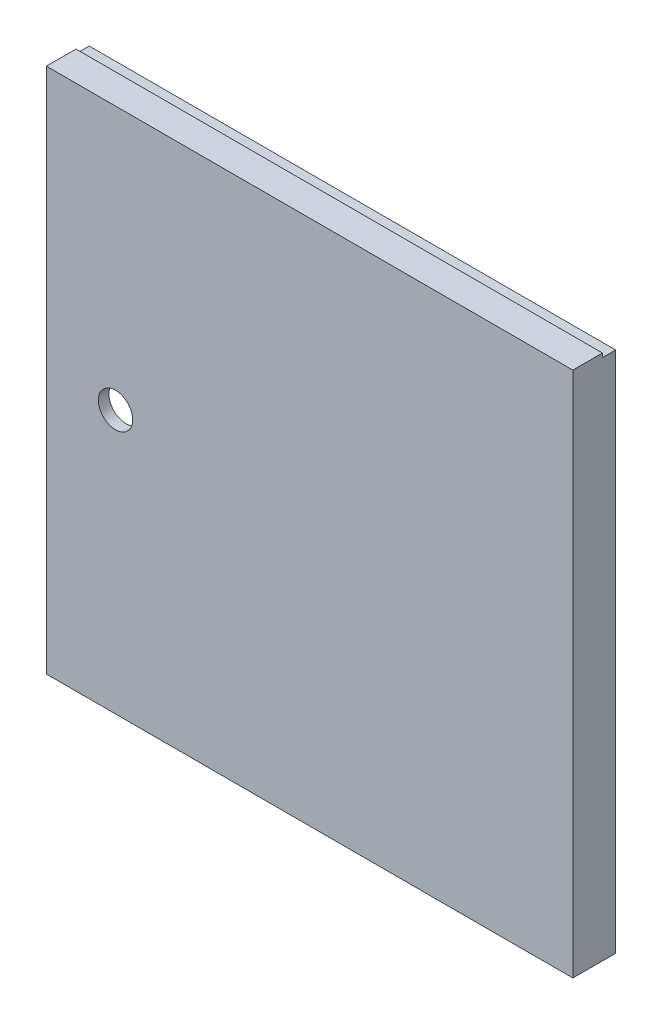
ISO-10303-21;
HEADER;
FILE_DESCRIPTION(('STEP AP214'),'2;1');
FILE_NAME('part.step','',(''),(''),'','','');
FILE_SCHEMA(('AUTOMOTIVE_DESIGN { 1 0 10303 214 1 1 1 1 }'));
ENDSEC;
DATA;
#1=APPLICATION_CONTEXT('core data for automotive mechanical design processes');
#2=APPLICATION_PROTOCOL_DEFINITION('international standard','automotive_design',2000,#1);
#3=PRODUCT_CONTEXT('',#1,'mechanical');
#4=PRODUCT('Part','Part','',(#3));
#5=PRODUCT_RELATED_PRODUCT_CATEGORY('part','',(#4));
#6=PRODUCT_DEFINITION_FORMATION('','',#4);
#7=PRODUCT_DEFINITION_CONTEXT('part definition',#1,'design');
#8=PRODUCT_DEFINITION('design','',#6,#7);
#9=PRODUCT_DEFINITION_SHAPE('','',#8);
#10=(LENGTH_UNIT() NAMED_UNIT(*) SI_UNIT(.MILLI.,.METRE.));
#11=(NAMED_UNIT(*) PLANE_ANGLE_UNIT() SI_UNIT($,.RADIAN.));
#12=(NAMED_UNIT(*) SI_UNIT($,.STERADIAN.) SOLID_ANGLE_UNIT());
#13=UNCERTAINTY_MEASURE_WITH_UNIT(LENGTH_MEASURE(1.E-05),#10,'distance_accuracy_value','');
#14=(GEOMETRIC_REPRESENTATION_CONTEXT(3) GLOBAL_UNCERTAINTY_ASSIGNED_CONTEXT((#13)) GLOBAL_UNIT_ASSIGNED_CONTEXT((#10,
#11,#12)) REPRESENTATION_CONTEXT('',''));
#15=CARTESIAN_POINT('',(0.,0.,0.));
#16=DIRECTION('',(0.,0.,1.));
#17=DIRECTION('',(1.,0.,0.));
#18=AXIS2_PLACEMENT_3D('',#15,#16,#17);
#19=CARTESIAN_POINT('',(50.8,-50.8,8.255));
#20=DIRECTION('',(-1.,0.,0.));
#21=DIRECTION('',(0.,0.,1.));
#22=AXIS2_PLACEMENT_3D('',#19,#20,#21);
#23=PLANE('',#22);
#24=DIRECTION('',(0.,1.,0.));
#25=VECTOR('',#24,1.);
#26=CARTESIAN_POINT('',(50.8,-50.8,0.));
#27=LINE('',#26,#25);
#28=CARTESIAN_POINT('',(50.8,-50.8,0.));
#29=VERTEX_POINT('',#28);
#30=CARTESIAN_POINT('',(50.8,50.038,0.));
#31=VERTEX_POINT('',#30);
#32=EDGE_CURVE('E146',#29,#31,#27,.T.);
#33=ORIENTED_EDGE('',*,*,#32,.T.);
#34=DIRECTION('',(0.,0.,-1.));
#35=VECTOR('',#34,1.);
#36=CARTESIAN_POINT('',(50.8,50.038,0.));
#37=LINE('',#36,#35);
#38=CARTESIAN_POINT('',(50.8,50.038,2.54));
#39=VERTEX_POINT('',#38);
#40=EDGE_CURVE('E49',#39,#31,#37,.T.);
#41=ORIENTED_EDGE('',*,*,#40,.F.);
#42=DIRECTION('',(0.,-1.,0.));
#43=VECTOR('',#42,1.);
#44=CARTESIAN_POINT('',(50.8,50.8,2.54));
#45=LINE('',#44,#43);
#46=CARTESIAN_POINT('',(50.8,50.8,2.54));
#47=VERTEX_POINT('',#46);
#48=EDGE_CURVE('E191',#47,#39,#45,.T.);
#49=ORIENTED_EDGE('',*,*,#48,.F.);
#50=DIRECTION('',(0.,0.,-1.));
#51=VECTOR('',#50,1.);
#52=CARTESIAN_POINT('',(50.8,50.8,8.255));
#53=LINE('',#52,#51);
#54=CARTESIAN_POINT('',(50.8,50.8,8.255));
#55=VERTEX_POINT('',#54);
#56=EDGE_CURVE('E12',#55,#47,#53,.T.);
#57=ORIENTED_EDGE('',*,*,#56,.F.);
#58=DIRECTION('',(0.,1.,0.));
#59=VECTOR('',#58,1.);
#60=CARTESIAN_POINT('',(50.8,-50.8,8.255));
#61=LINE('',#60,#59);
#62=CARTESIAN_POINT('',(50.8,-50.8,8.255));
#63=VERTEX_POINT('',#62);
#64=EDGE_CURVE('E143',#63,#55,#61,.T.);
#65=ORIENTED_EDGE('',*,*,#64,.F.);
#66=DIRECTION('',(0.,0.,-1.));
#67=VECTOR('',#66,1.);
#68=CARTESIAN_POINT('',(50.8,-50.8,8.255));
#69=LINE('',#68,#67);
#70=EDGE_CURVE('E135',#63,#29,#69,.T.);
#71=ORIENTED_EDGE('',*,*,#70,.T.);
#72=EDGE_LOOP('',(#33,#41,#49,#57,#65,#71));
#73=FACE_BOUND('',#72,.T.);
#74=ADVANCED_FACE('F35',(#73),#23,.F.);
#75=CARTESIAN_POINT('',(-50.8,50.8,8.255));
#76=DIRECTION('',(0.,-1.,0.));
#77=DIRECTION('',(0.,0.,-1.));
#78=AXIS2_PLACEMENT_3D('',#75,#76,#77);
#79=PLANE('',#78);
#80=ORIENTED_EDGE('',*,*,#56,.T.);
#81=DIRECTION('',(1.,0.,0.));
#82=VECTOR('',#81,1.);
#83=CARTESIAN_POINT('',(-50.8,50.8,2.54));
#84=LINE('',#83,#82);
#85=CARTESIAN_POINT('',(-50.8,50.8,2.54));
#86=VERTEX_POINT('',#85);
#87=EDGE_CURVE('E115',#86,#47,#84,.T.);
#88=ORIENTED_EDGE('',*,*,#87,.F.);
#89=DIRECTION('',(0.,0.,-1.));
#90=VECTOR('',#89,1.);
#91=CARTESIAN_POINT('',(-50.8,50.8,8.255));
#92=LINE('',#91,#90);
#93=CARTESIAN_POINT('',(-50.8,50.8,8.255));
#94=VERTEX_POINT('',#93);
#95=EDGE_CURVE('E42',#94,#86,#92,.T.);
#96=ORIENTED_EDGE('',*,*,#95,.F.);
#97=DIRECTION('',(-1.,0.,0.));
#98=VECTOR('',#97,1.);
#99=CARTESIAN_POINT('',(-50.8,50.8,8.255));
#100=LINE('',#99,#98);
#101=EDGE_CURVE('E152',#55,#94,#100,.T.);
#102=ORIENTED_EDGE('',*,*,#101,.F.);
#103=EDGE_LOOP('',(#80,#88,#96,#102));
#104=FACE_BOUND('',#103,.T.);
#105=ADVANCED_FACE('F126',(#104),#79,.F.);
#106=CARTESIAN_POINT('',(-50.8,-50.8,8.255));
#107=DIRECTION('',(1.,0.,0.));
#108=DIRECTION('',(0.,0.,-1.));
#109=AXIS2_PLACEMENT_3D('',#106,#107,#108);
#110=PLANE('',#109);
#111=DIRECTION('',(0.,-1.,0.));
#112=VECTOR('',#111,1.);
#113=CARTESIAN_POINT('',(-50.8,50.8,2.54));
#114=LINE('',#113,#112);
#115=CARTESIAN_POINT('',(-50.8,50.038,2.54));
#116=VERTEX_POINT('',#115);
#117=EDGE_CURVE('E111',#86,#116,#114,.T.);
#118=ORIENTED_EDGE('',*,*,#117,.T.);
#119=DIRECTION('',(0.,0.,-1.));
#120=VECTOR('',#119,1.);
#121=CARTESIAN_POINT('',(-50.8,50.038,0.));
#122=LINE('',#121,#120);
#123=CARTESIAN_POINT('',(-50.8,50.038,0.));
#124=VERTEX_POINT('',#123);
#125=EDGE_CURVE('E122',#116,#124,#122,.T.);
#126=ORIENTED_EDGE('',*,*,#125,.T.);
#127=DIRECTION('',(0.,-1.,0.));
#128=VECTOR('',#127,1.);
#129=CARTESIAN_POINT('',(-50.8,-50.8,0.));
#130=LINE('',#129,#128);
#131=CARTESIAN_POINT('',(-50.8,-50.8,0.));
#132=VERTEX_POINT('',#131);
#133=EDGE_CURVE('E144',#124,#132,#130,.T.);
#134=ORIENTED_EDGE('',*,*,#133,.T.);
#135=DIRECTION('',(0.,0.,-1.));
#136=VECTOR('',#135,1.);
#137=CARTESIAN_POINT('',(-50.8,-50.8,8.255));
#138=LINE('',#137,#136);
#139=CARTESIAN_POINT('',(-50.8,-50.8,8.255));
#140=VERTEX_POINT('',#139);
#141=EDGE_CURVE('E133',#140,#132,#138,.T.);
#142=ORIENTED_EDGE('',*,*,#141,.F.);
#143=DIRECTION('',(0.,-1.,0.));
#144=VECTOR('',#143,1.);
#145=CARTESIAN_POINT('',(-50.8,-50.8,8.255));
#146=LINE('',#145,#144);
#147=EDGE_CURVE('E132',#94,#140,#146,.T.);
#148=ORIENTED_EDGE('',*,*,#147,.F.);
#149=ORIENTED_EDGE('',*,*,#95,.T.);
#150=EDGE_LOOP('',(#118,#126,#134,#142,#148,#149));
#151=FACE_BOUND('',#150,.T.);
#152=ADVANCED_FACE('F130',(#151),#110,.F.);
#153=CARTESIAN_POINT('',(-50.8,-50.8,8.255));
#154=DIRECTION('',(0.,1.,0.));
#155=DIRECTION('',(0.,0.,1.));
#156=AXIS2_PLACEMENT_3D('',#153,#154,#155);
#157=PLANE('',#156);
#158=DIRECTION('',(1.,0.,0.));
#159=VECTOR('',#158,1.);
#160=CARTESIAN_POINT('',(-50.8,-50.8,0.));
#161=LINE('',#160,#159);
#162=EDGE_CURVE('E141',#132,#29,#161,.T.);
#163=ORIENTED_EDGE('',*,*,#162,.T.);
#164=ORIENTED_EDGE('',*,*,#70,.F.);
#165=DIRECTION('',(1.,0.,0.));
#166=VECTOR('',#165,1.);
#167=CARTESIAN_POINT('',(-50.8,-50.8,8.255));
#168=LINE('',#167,#166);
#169=EDGE_CURVE('E140',#140,#63,#168,.T.);
#170=ORIENTED_EDGE('',*,*,#169,.F.);
#171=ORIENTED_EDGE('',*,*,#141,.T.);
#172=EDGE_LOOP('',(#163,#164,#170,#171));
#173=FACE_BOUND('',#172,.T.);
#174=ADVANCED_FACE('F201',(#173),#157,.F.);
#175=CARTESIAN_POINT('',(0.,0.,8.255));
#176=DIRECTION('',(0.,0.,-1.));
#177=DIRECTION('',(-1.,0.,0.));
#178=AXIS2_PLACEMENT_3D('',#175,#176,#177);
#179=PLANE('',#178);
#180=CARTESIAN_POINT('',(-37.4564909021522,0.,8.255));
#181=DIRECTION('',(0.,0.,1.));
#182=DIRECTION('',(1.,0.,0.));
#183=AXIS2_PLACEMENT_3D('',#180,#181,#182);
#184=CIRCLE('',#183,3.31110911723338);
#185=CARTESIAN_POINT('',(-34.1453817849189,0.,8.255));
#186=VERTEX_POINT('',#185);
#187=EDGE_CURVE('E182',#186,#186,#184,.T.);
#188=ORIENTED_EDGE('',*,*,#187,.F.);
#189=EDGE_LOOP('',(#188));
#190=FACE_BOUND('',#189,.T.);
#191=ORIENTED_EDGE('',*,*,#64,.T.);
#192=ORIENTED_EDGE('',*,*,#101,.T.);
#193=ORIENTED_EDGE('',*,*,#147,.T.);
#194=ORIENTED_EDGE('',*,*,#169,.T.);
#195=EDGE_LOOP('',(#191,#192,#193,#194));
#196=FACE_BOUND('',#195,.T.);
#197=ADVANCED_FACE('F206',(#190,#196),#179,.F.);
#198=CARTESIAN_POINT('',(0.,0.,0.));
#199=DIRECTION('',(0.,0.,-1.));
#200=DIRECTION('',(-1.,0.,0.));
#201=AXIS2_PLACEMENT_3D('',#198,#199,#200);
#202=PLANE('',#201);
#203=DIRECTION('',(1.,0.,0.));
#204=VECTOR('',#203,1.);
#205=CARTESIAN_POINT('',(-50.8,50.038,0.));
#206=LINE('',#205,#204);
#207=EDGE_CURVE('E185',#124,#31,#206,.T.);
#208=ORIENTED_EDGE('',*,*,#207,.T.);
#209=ORIENTED_EDGE('',*,*,#32,.F.);
#210=ORIENTED_EDGE('',*,*,#162,.F.);
#211=ORIENTED_EDGE('',*,*,#133,.F.);
#212=EDGE_LOOP('',(#208,#209,#210,#211));
#213=FACE_BOUND('',#212,.T.);
#214=DIRECTION('',(0.,-1.,0.));
#215=VECTOR('',#214,1.);
#216=CARTESIAN_POINT('',(48.768,-48.768,0.));
#217=LINE('',#216,#215);
#218=CARTESIAN_POINT('',(48.768,48.768,0.));
#219=VERTEX_POINT('',#218);
#220=CARTESIAN_POINT('',(48.768,-48.768,0.));
#221=VERTEX_POINT('',#220);
#222=EDGE_CURVE('E57',#219,#221,#217,.T.);
#223=ORIENTED_EDGE('',*,*,#222,.F.);
#224=DIRECTION('',(1.,0.,0.));
#225=VECTOR('',#224,1.);
#226=CARTESIAN_POINT('',(48.768,48.768,0.));
#227=LINE('',#226,#225);
#228=CARTESIAN_POINT('',(-48.768,48.768,0.));
#229=VERTEX_POINT('',#228);
#230=EDGE_CURVE('E161',#229,#219,#227,.T.);
#231=ORIENTED_EDGE('',*,*,#230,.F.);
#232=DIRECTION('',(0.,1.,0.));
#233=VECTOR('',#232,1.);
#234=CARTESIAN_POINT('',(-48.768,-48.768,0.));
#235=LINE('',#234,#233);
#236=CARTESIAN_POINT('',(-48.768,-48.768,0.));
#237=VERTEX_POINT('',#236);
#238=EDGE_CURVE('E170',#237,#229,#235,.T.);
#239=ORIENTED_EDGE('',*,*,#238,.F.);
#240=DIRECTION('',(-1.,0.,0.));
#241=VECTOR('',#240,1.);
#242=CARTESIAN_POINT('',(48.768,-48.768,0.));
#243=LINE('',#242,#241);
#244=EDGE_CURVE('E173',#221,#237,#243,.T.);
#245=ORIENTED_EDGE('',*,*,#244,.F.);
#246=EDGE_LOOP('',(#223,#231,#239,#245));
#247=FACE_BOUND('',#246,.T.);
#248=ADVANCED_FACE('F196',(#213,#247),#202,.T.);
#249=CARTESIAN_POINT('',(48.768,-48.768,146.191734019622));
#250=DIRECTION('',(1.,0.,0.));
#251=DIRECTION('',(0.,0.,-1.));
#252=AXIS2_PLACEMENT_3D('',#249,#250,#251);
#253=PLANE('',#252);
#254=DIRECTION('',(0.,1.,0.));
#255=VECTOR('',#254,1.);
#256=CARTESIAN_POINT('',(48.768,-48.768,6.22300000000001));
#257=LINE('',#256,#255);
#258=CARTESIAN_POINT('',(48.768,-48.768,6.22300000000001));
#259=VERTEX_POINT('',#258);
#260=CARTESIAN_POINT('',(48.768,48.768,6.22300000000001));
#261=VERTEX_POINT('',#260);
#262=EDGE_CURVE('E157',#259,#261,#257,.T.);
#263=ORIENTED_EDGE('',*,*,#262,.T.);
#264=DIRECTION('',(0.,0.,-1.));
#265=VECTOR('',#264,1.);
#266=CARTESIAN_POINT('',(48.768,48.768,146.191734019622));
#267=LINE('',#266,#265);
#268=EDGE_CURVE('E165',#261,#219,#267,.T.);
#269=ORIENTED_EDGE('',*,*,#268,.T.);
#270=ORIENTED_EDGE('',*,*,#222,.T.);
#271=DIRECTION('',(0.,0.,-1.));
#272=VECTOR('',#271,1.);
#273=CARTESIAN_POINT('',(48.768,-48.768,146.191734019622));
#274=LINE('',#273,#272);
#275=EDGE_CURVE('E158',#259,#221,#274,.T.);
#276=ORIENTED_EDGE('',*,*,#275,.F.);
#277=EDGE_LOOP('',(#263,#269,#270,#276));
#278=FACE_BOUND('',#277,.T.);
#279=ADVANCED_FACE('F214',(#278),#253,.F.);
#280=CARTESIAN_POINT('',(48.768,48.768,146.191734019622));
#281=DIRECTION('',(0.,1.,0.));
#282=DIRECTION('',(0.,0.,1.));
#283=AXIS2_PLACEMENT_3D('',#280,#281,#282);
#284=PLANE('',#283);
#285=DIRECTION('',(-1.,0.,0.));
#286=VECTOR('',#285,1.);
#287=CARTESIAN_POINT('',(48.768,48.768,6.22300000000001));
#288=LINE('',#287,#286);
#289=CARTESIAN_POINT('',(-48.768,48.768,6.22300000000001));
#290=VERTEX_POINT('',#289);
#291=EDGE_CURVE('E179',#261,#290,#288,.T.);
#292=ORIENTED_EDGE('',*,*,#291,.T.);
#293=DIRECTION('',(0.,0.,-1.));
#294=VECTOR('',#293,1.);
#295=CARTESIAN_POINT('',(-48.768,48.768,146.191734019622));
#296=LINE('',#295,#294);
#297=EDGE_CURVE('E163',#290,#229,#296,.T.);
#298=ORIENTED_EDGE('',*,*,#297,.T.);
#299=ORIENTED_EDGE('',*,*,#230,.T.);
#300=ORIENTED_EDGE('',*,*,#268,.F.);
#301=EDGE_LOOP('',(#292,#298,#299,#300));
#302=FACE_BOUND('',#301,.T.);
#303=ADVANCED_FACE('F244',(#302),#284,.F.);
#304=CARTESIAN_POINT('',(-48.768,-48.768,146.191734019622));
#305=DIRECTION('',(-1.,0.,0.));
#306=DIRECTION('',(0.,0.,1.));
#307=AXIS2_PLACEMENT_3D('',#304,#305,#306);
#308=PLANE('',#307);
#309=DIRECTION('',(0.,-1.,0.));
#310=VECTOR('',#309,1.);
#311=CARTESIAN_POINT('',(-48.768,-48.768,6.22300000000001));
#312=LINE('',#311,#310);
#313=CARTESIAN_POINT('',(-48.768,-48.768,6.22300000000001));
#314=VERTEX_POINT('',#313);
#315=EDGE_CURVE('E167',#290,#314,#312,.T.);
#316=ORIENTED_EDGE('',*,*,#315,.T.);
#317=DIRECTION('',(0.,0.,-1.));
#318=VECTOR('',#317,1.);
#319=CARTESIAN_POINT('',(-48.768,-48.768,146.191734019622));
#320=LINE('',#319,#318);
#321=EDGE_CURVE('E160',#314,#237,#320,.T.);
#322=ORIENTED_EDGE('',*,*,#321,.T.);
#323=ORIENTED_EDGE('',*,*,#238,.T.);
#324=ORIENTED_EDGE('',*,*,#297,.F.);
#325=EDGE_LOOP('',(#316,#322,#323,#324));
#326=FACE_BOUND('',#325,.T.);
#327=ADVANCED_FACE('F253',(#326),#308,.F.);
#328=CARTESIAN_POINT('',(48.768,-48.768,146.191734019622));
#329=DIRECTION('',(0.,-1.,0.));
#330=DIRECTION('',(0.,0.,-1.));
#331=AXIS2_PLACEMENT_3D('',#328,#329,#330);
#332=PLANE('',#331);
#333=DIRECTION('',(1.,0.,0.));
#334=VECTOR('',#333,1.);
#335=CARTESIAN_POINT('',(48.768,-48.768,6.22300000000001));
#336=LINE('',#335,#334);
#337=EDGE_CURVE('E149',#314,#259,#336,.T.);
#338=ORIENTED_EDGE('',*,*,#337,.T.);
#339=ORIENTED_EDGE('',*,*,#275,.T.);
#340=ORIENTED_EDGE('',*,*,#244,.T.);
#341=ORIENTED_EDGE('',*,*,#321,.F.);
#342=EDGE_LOOP('',(#338,#339,#340,#341));
#343=FACE_BOUND('',#342,.T.);
#344=ADVANCED_FACE('F263',(#343),#332,.F.);
#345=CARTESIAN_POINT('',(0.,0.,6.223));
#346=DIRECTION('',(0.,0.,-1.));
#347=DIRECTION('',(-1.,0.,0.));
#348=AXIS2_PLACEMENT_3D('',#345,#346,#347);
#349=PLANE('',#348);
#350=CARTESIAN_POINT('',(-37.4564909021522,0.,6.223));
#351=DIRECTION('',(0.,0.,1.));
#352=DIRECTION('',(1.,0.,0.));
#353=AXIS2_PLACEMENT_3D('',#350,#351,#352);
#354=CIRCLE('',#353,3.31110911723338);
#355=CARTESIAN_POINT('',(-34.1453817849189,0.,6.223));
#356=VERTEX_POINT('',#355);
#357=EDGE_CURVE('E177',#356,#356,#354,.T.);
#358=ORIENTED_EDGE('',*,*,#357,.T.);
#359=EDGE_LOOP('',(#358));
#360=FACE_BOUND('',#359,.T.);
#361=ORIENTED_EDGE('',*,*,#262,.F.);
#362=ORIENTED_EDGE('',*,*,#337,.F.);
#363=ORIENTED_EDGE('',*,*,#315,.F.);
#364=ORIENTED_EDGE('',*,*,#291,.F.);
#365=EDGE_LOOP('',(#361,#362,#363,#364));
#366=FACE_BOUND('',#365,.T.);
#367=ADVANCED_FACE('F272',(#360,#366),#349,.T.);
#368=CARTESIAN_POINT('',(-37.4564909021522,0.,6.223));
#369=DIRECTION('',(0.,0.,1.));
#370=DIRECTION('',(1.,0.,0.));
#371=AXIS2_PLACEMENT_3D('',#368,#369,#370);
#372=CYLINDRICAL_SURFACE('',#371,3.31110911723338);
#373=ORIENTED_EDGE('',*,*,#357,.F.);
#374=EDGE_LOOP('',(#373));
#375=FACE_BOUND('',#374,.T.);
#376=ORIENTED_EDGE('',*,*,#187,.T.);
#377=EDGE_LOOP('',(#376));
#378=FACE_BOUND('',#377,.T.);
#379=ADVANCED_FACE('F286',(#375,#378),#372,.F.);
#380=CARTESIAN_POINT('',(-50.8,50.038,0.));
#381=DIRECTION('',(0.,-1.,0.));
#382=DIRECTION('',(0.,0.,-1.));
#383=AXIS2_PLACEMENT_3D('',#380,#381,#382);
#384=PLANE('',#383);
#385=ORIENTED_EDGE('',*,*,#40,.T.);
#386=ORIENTED_EDGE('',*,*,#207,.F.);
#387=ORIENTED_EDGE('',*,*,#125,.F.);
#388=DIRECTION('',(1.,0.,0.));
#389=VECTOR('',#388,1.);
#390=CARTESIAN_POINT('',(-50.8,50.038,2.54));
#391=LINE('',#390,#389);
#392=EDGE_CURVE('E117',#116,#39,#391,.T.);
#393=ORIENTED_EDGE('',*,*,#392,.T.);
#394=EDGE_LOOP('',(#385,#386,#387,#393));
#395=FACE_BOUND('',#394,.T.);
#396=ADVANCED_FACE('F295',(#395),#384,.F.);
#397=CARTESIAN_POINT('',(-50.8,50.8,2.54));
#398=DIRECTION('',(0.,0.,1.));
#399=DIRECTION('',(0.,-1.,0.));
#400=AXIS2_PLACEMENT_3D('',#397,#398,#399);
#401=PLANE('',#400);
#402=ORIENTED_EDGE('',*,*,#48,.T.);
#403=ORIENTED_EDGE('',*,*,#392,.F.);
#404=ORIENTED_EDGE('',*,*,#117,.F.);
#405=ORIENTED_EDGE('',*,*,#87,.T.);
#406=EDGE_LOOP('',(#402,#403,#404,#405));
#407=FACE_BOUND('',#406,.T.);
#408=ADVANCED_FACE('F114',(#407),#401,.F.);
#409=CLOSED_SHELL('',(#74,#105,#152,#174,#197,#248,#279,#303,#327,#344,#367,#379,#396,#408));
#410=MANIFOLD_SOLID_BREP('B2',#409);
#411=ADVANCED_BREP_SHAPE_REPRESENTATION('',(#18,#410),#14);
#412=SHAPE_DEFINITION_REPRESENTATION(#9,#411);
ENDSEC;
END-ISO-10303-21;
